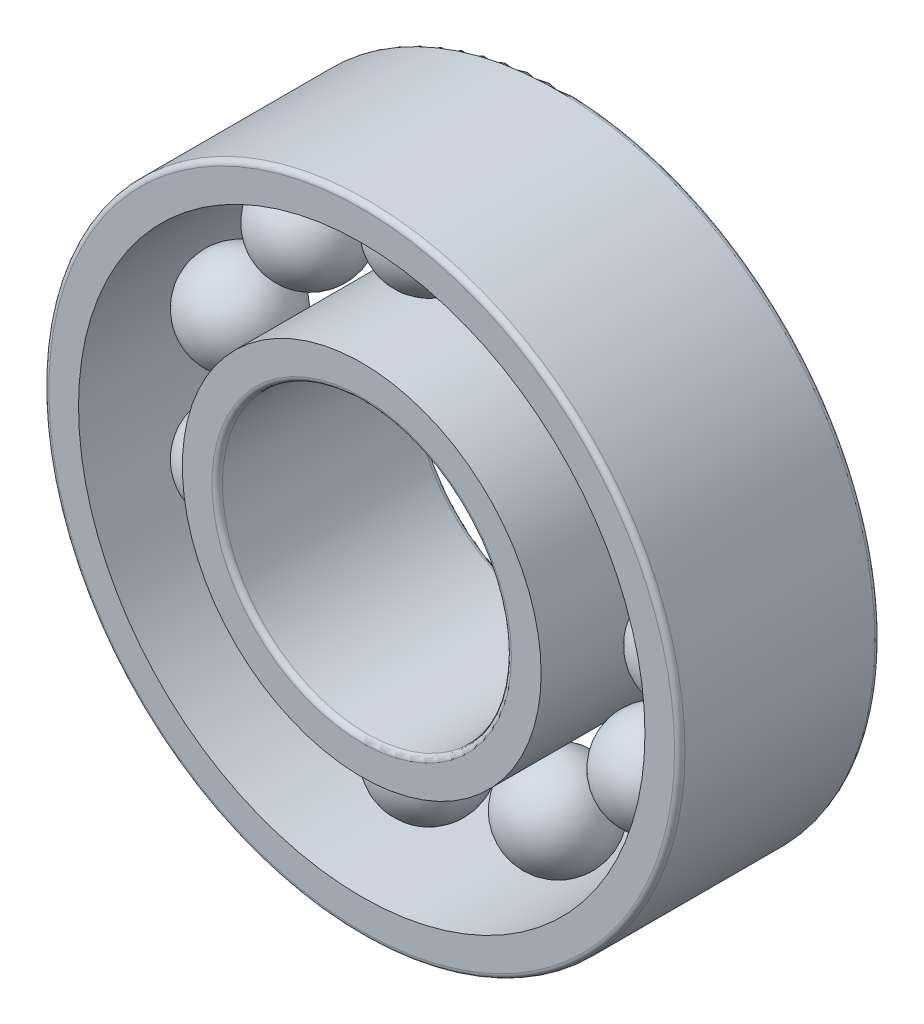
ISO-10303-21;
HEADER;
FILE_DESCRIPTION(('STEP AP214'),'2;1');
FILE_NAME('part.step','',(''),(''),'','','');
FILE_SCHEMA(('AUTOMOTIVE_DESIGN { 1 0 10303 214 1 1 1 1 }'));
ENDSEC;
DATA;
#1=APPLICATION_CONTEXT('core data for automotive mechanical design processes');
#2=APPLICATION_PROTOCOL_DEFINITION('international standard','automotive_design',2000,#1);
#3=PRODUCT_CONTEXT('',#1,'mechanical');
#4=PRODUCT('Part','Part','',(#3));
#5=PRODUCT_RELATED_PRODUCT_CATEGORY('part','',(#4));
#6=PRODUCT_DEFINITION_FORMATION('','',#4);
#7=PRODUCT_DEFINITION_CONTEXT('part definition',#1,'design');
#8=PRODUCT_DEFINITION('design','',#6,#7);
#9=PRODUCT_DEFINITION_SHAPE('','',#8);
#10=(LENGTH_UNIT() NAMED_UNIT(*) SI_UNIT(.MILLI.,.METRE.));
#11=(NAMED_UNIT(*) PLANE_ANGLE_UNIT() SI_UNIT($,.RADIAN.));
#12=(NAMED_UNIT(*) SI_UNIT($,.STERADIAN.) SOLID_ANGLE_UNIT());
#13=UNCERTAINTY_MEASURE_WITH_UNIT(LENGTH_MEASURE(1.E-05),#10,'distance_accuracy_value','');
#14=(GEOMETRIC_REPRESENTATION_CONTEXT(3) GLOBAL_UNCERTAINTY_ASSIGNED_CONTEXT((#13)) GLOBAL_UNIT_ASSIGNED_CONTEXT((#10,
#11,#12)) REPRESENTATION_CONTEXT('',''));
#15=CARTESIAN_POINT('',(0.,0.,0.));
#16=DIRECTION('',(0.,0.,1.));
#17=DIRECTION('',(1.,0.,0.));
#18=AXIS2_PLACEMENT_3D('',#15,#16,#17);
#19=CARTESIAN_POINT('',(10.683919866956,-6.86613838168609,0.));
#20=DIRECTION('',(-0.841253532831181,0.540640817455598,0.));
#21=DIRECTION('',(0.,0.,-1.));
#22=AXIS2_PLACEMENT_3D('',#19,#20,#21);
#23=SPHERICAL_SURFACE('',#22,2.7075);
#24=CARTESIAN_POINT('',(8.40622592681558,-5.40235336842506,0.));
#25=VERTEX_POINT('',#24);
#26=VERTEX_LOOP('',#25);
#27=FACE_BOUND('',#26,.T.);
#28=ADVANCED_FACE('F38',(#27),#23,.T.);
#29=CLOSED_SHELL('',(#28));
#30=MANIFOLD_SOLID_BREP('B2',#29);
#31=CARTESIAN_POINT('',(5.27577066512395,-11.5523263410024,0.));
#32=DIRECTION('',(-0.415415013001886,0.909631995354519,0.));
#33=DIRECTION('',(0.,0.,-1.));
#34=AXIS2_PLACEMENT_3D('',#31,#32,#33);
#35=SPHERICAL_SURFACE('',#34,2.7075);
#36=CARTESIAN_POINT('',(4.15103451742135,-9.08949771358003,0.));
#37=VERTEX_POINT('',#36);
#38=VERTEX_LOOP('',#37);
#39=FACE_BOUND('',#38,.T.);
#40=ADVANCED_FACE('F57',(#39),#35,.T.);
#41=CLOSED_SHELL('',(#40));
#42=MANIFOLD_SOLID_BREP('B6',#41);
#43=CARTESIAN_POINT('',(-1.80739844607072,-12.5707323118878,0.));
#44=DIRECTION('',(0.142314838273285,0.989821441880933,0.));
#45=DIRECTION('',(0.,0.,-1.));
#46=AXIS2_PLACEMENT_3D('',#43,#44,#45);
#47=SPHERICAL_SURFACE('',#46,2.7075);
#48=CARTESIAN_POINT('',(-1.4220810214458,-9.89079075799522,0.));
#49=VERTEX_POINT('',#48);
#50=VERTEX_LOOP('',#49);
#51=FACE_BOUND('',#50,.T.);
#52=ADVANCED_FACE('F76',(#51),#47,.T.);
#53=CLOSED_SHELL('',(#52));
#54=MANIFOLD_SOLID_BREP('B34',#53);
#55=CARTESIAN_POINT('',(-8.31673132110512,-9.59801959429908,0.));
#56=DIRECTION('',(0.654860733945285,0.755749574354258,0.));
#57=DIRECTION('',(0.,0.,-1.));
#58=AXIS2_PLACEMENT_3D('',#55,#56,#57);
#59=SPHERICAL_SURFACE('',#58,2.7075);
#60=CARTESIAN_POINT('',(-6.54369588394826,-7.55182762173492,0.));
#61=VERTEX_POINT('',#60);
#62=VERTEX_LOOP('',#61);
#63=FACE_BOUND('',#62,.T.);
#64=ADVANCED_FACE('F95',(#63),#59,.T.);
#65=CLOSED_SHELL('',(#64));
#66=MANIFOLD_SOLID_BREP('B53',#65);
#67=CARTESIAN_POINT('',(-12.1855607649041,-3.57800347188615,0.));
#68=DIRECTION('',(0.959492973614497,0.281732556841429,0.));
#69=DIRECTION('',(0.,0.,-1.));
#70=AXIS2_PLACEMENT_3D('',#67,#68,#69);
#71=SPHERICAL_SURFACE('',#70,2.7075);
#72=CARTESIAN_POINT('',(-9.58773353884287,-2.81521257423798,0.));
#73=VERTEX_POINT('',#72);
#74=VERTEX_LOOP('',#73);
#75=FACE_BOUND('',#74,.T.);
#76=ADVANCED_FACE('F114',(#75),#71,.T.);
#77=CLOSED_SHELL('',(#76));
#78=MANIFOLD_SOLID_BREP('B72',#77);
#79=CARTESIAN_POINT('',(-12.1855607649041,3.57800347188616,0.));
#80=DIRECTION('',(0.959492973614498,-0.28173255684143,0.));
#81=DIRECTION('',(0.,0.,-1.));
#82=AXIS2_PLACEMENT_3D('',#79,#80,#81);
#83=SPHERICAL_SURFACE('',#82,2.7075);
#84=CARTESIAN_POINT('',(-9.58773353884287,2.81521257423799,0.));
#85=VERTEX_POINT('',#84);
#86=VERTEX_LOOP('',#85);
#87=FACE_BOUND('',#86,.T.);
#88=ADVANCED_FACE('F133',(#87),#83,.T.);
#89=CLOSED_SHELL('',(#88));
#90=MANIFOLD_SOLID_BREP('B91',#89);
#91=CARTESIAN_POINT('',(-8.31673132110512,9.59801959429908,0.));
#92=DIRECTION('',(0.654860733945285,-0.755749574354258,0.));
#93=DIRECTION('',(0.,0.,-1.));
#94=AXIS2_PLACEMENT_3D('',#91,#92,#93);
#95=SPHERICAL_SURFACE('',#94,2.7075);
#96=CARTESIAN_POINT('',(-6.54369588394826,7.55182762173493,0.));
#97=VERTEX_POINT('',#96);
#98=VERTEX_LOOP('',#97);
#99=FACE_BOUND('',#98,.T.);
#100=ADVANCED_FACE('F152',(#99),#95,.T.);
#101=CLOSED_SHELL('',(#100));
#102=MANIFOLD_SOLID_BREP('B110',#101);
#103=CARTESIAN_POINT('',(-1.80739844607072,12.5707323118878,0.));
#104=DIRECTION('',(0.142314838273285,-0.989821441880933,0.));
#105=DIRECTION('',(0.,0.,-1.));
#106=AXIS2_PLACEMENT_3D('',#103,#104,#105);
#107=SPHERICAL_SURFACE('',#106,2.7075);
#108=CARTESIAN_POINT('',(-1.4220810214458,9.89079075799522,0.));
#109=VERTEX_POINT('',#108);
#110=VERTEX_LOOP('',#109);
#111=FACE_BOUND('',#110,.T.);
#112=ADVANCED_FACE('F171',(#111),#107,.T.);
#113=CLOSED_SHELL('',(#112));
#114=MANIFOLD_SOLID_BREP('B129',#113);
#115=CARTESIAN_POINT('',(5.27577066512396,11.5523263410024,0.));
#116=DIRECTION('',(-0.415415013001886,-0.909631995354518,0.));
#117=DIRECTION('',(0.,0.,-1.));
#118=AXIS2_PLACEMENT_3D('',#115,#116,#117);
#119=SPHERICAL_SURFACE('',#118,2.7075);
#120=CARTESIAN_POINT('',(4.15103451742135,9.08949771358002,0.));
#121=VERTEX_POINT('',#120);
#122=VERTEX_LOOP('',#121);
#123=FACE_BOUND('',#122,.T.);
#124=ADVANCED_FACE('F190',(#123),#119,.T.);
#125=CLOSED_SHELL('',(#124));
#126=MANIFOLD_SOLID_BREP('B148',#125);
#127=CARTESIAN_POINT('',(10.683919866956,6.86613838168609,0.));
#128=DIRECTION('',(-0.841253532831181,-0.540640817455598,0.));
#129=DIRECTION('',(0.,0.,-1.));
#130=AXIS2_PLACEMENT_3D('',#127,#128,#129);
#131=SPHERICAL_SURFACE('',#130,2.7075);
#132=CARTESIAN_POINT('',(8.40622592681558,5.40235336842506,0.));
#133=VERTEX_POINT('',#132);
#134=VERTEX_LOOP('',#133);
#135=FACE_BOUND('',#134,.T.);
#136=ADVANCED_FACE('F209',(#135),#131,.T.);
#137=CLOSED_SHELL('',(#136));
#138=MANIFOLD_SOLID_BREP('B167',#137);
#139=CARTESIAN_POINT('',(12.7,0.,0.));
#140=DIRECTION('',(-1.,0.,0.));
#141=DIRECTION('',(0.,0.,-1.));
#142=AXIS2_PLACEMENT_3D('',#139,#140,#141);
#143=SPHERICAL_SURFACE('',#142,2.7075);
#144=CARTESIAN_POINT('',(9.9925,0.,0.));
#145=VERTEX_POINT('',#144);
#146=VERTEX_LOOP('',#145);
#147=FACE_BOUND('',#146,.T.);
#148=ADVANCED_FACE('F230',(#147),#143,.T.);
#149=CLOSED_SHELL('',(#148));
#150=MANIFOLD_SOLID_BREP('B186',#149);
#151=CARTESIAN_POINT('',(0.,0.,9.25));
#152=DIRECTION('',(0.,0.,1.));
#153=DIRECTION('',(1.,0.,0.));
#154=AXIS2_PLACEMENT_3D('',#151,#152,#153);
#155=CYLINDRICAL_SURFACE('',#154,15.55);
#156=CARTESIAN_POINT('',(0.,0.,5.5));
#157=DIRECTION('',(0.,0.,1.));
#158=DIRECTION('',(1.,0.,0.));
#159=AXIS2_PLACEMENT_3D('',#156,#157,#158);
#160=CIRCLE('',#159,15.55);
#161=CARTESIAN_POINT('',(15.55,0.,5.5));
#162=VERTEX_POINT('',#161);
#163=EDGE_CURVE('E270',#162,#162,#160,.T.);
#164=ORIENTED_EDGE('',*,*,#163,.T.);
#165=EDGE_LOOP('',(#164));
#166=FACE_BOUND('',#165,.T.);
#167=CARTESIAN_POINT('',(0.,0.,-5.5));
#168=DIRECTION('',(0.,0.,1.));
#169=DIRECTION('',(1.,0.,0.));
#170=AXIS2_PLACEMENT_3D('',#167,#168,#169);
#171=CIRCLE('',#170,15.55);
#172=CARTESIAN_POINT('',(15.55,0.,-5.5));
#173=VERTEX_POINT('',#172);
#174=EDGE_CURVE('E273',#173,#173,#171,.T.);
#175=ORIENTED_EDGE('',*,*,#174,.F.);
#176=EDGE_LOOP('',(#175));
#177=FACE_BOUND('',#176,.T.);
#178=ADVANCED_FACE('F250',(#166,#177),#155,.F.);
#179=CARTESIAN_POINT('',(15.55,0.,5.5));
#180=DIRECTION('',(0.,0.,1.));
#181=DIRECTION('',(1.,0.,0.));
#182=AXIS2_PLACEMENT_3D('',#179,#180,#181);
#183=PLANE('',#182);
#184=CARTESIAN_POINT('',(0.,0.,5.5));
#185=DIRECTION('',(0.,0.,1.));
#186=DIRECTION('',(1.,0.,0.));
#187=AXIS2_PLACEMENT_3D('',#184,#185,#186);
#188=CIRCLE('',#187,17.17675);
#189=CARTESIAN_POINT('',(17.17675,0.,5.5));
#190=VERTEX_POINT('',#189);
#191=EDGE_CURVE('E229',#190,#190,#188,.T.);
#192=ORIENTED_EDGE('',*,*,#191,.T.);
#193=EDGE_LOOP('',(#192));
#194=FACE_BOUND('',#193,.T.);
#195=ORIENTED_EDGE('',*,*,#163,.F.);
#196=EDGE_LOOP('',(#195));
#197=FACE_BOUND('',#196,.T.);
#198=ADVANCED_FACE('F280',(#194,#197),#183,.T.);
#199=CARTESIAN_POINT('',(0.,0.,9.25));
#200=DIRECTION('',(0.,0.,1.));
#201=DIRECTION('',(1.,0.,0.));
#202=AXIS2_PLACEMENT_3D('',#199,#200,#201);
#203=CYLINDRICAL_SURFACE('',#202,17.4625);
#204=CARTESIAN_POINT('',(0.,0.,-5.21425));
#205=DIRECTION('',(0.,0.,-1.));
#206=DIRECTION('',(-1.,0.,0.));
#207=AXIS2_PLACEMENT_3D('',#204,#205,#206);
#208=CIRCLE('',#207,17.4625);
#209=CARTESIAN_POINT('',(-17.4625,0.,-5.21425));
#210=VERTEX_POINT('',#209);
#211=EDGE_CURVE('E261',#210,#210,#208,.F.);
#212=ORIENTED_EDGE('',*,*,#211,.T.);
#213=EDGE_LOOP('',(#212));
#214=FACE_BOUND('',#213,.T.);
#215=CARTESIAN_POINT('',(0.,0.,5.21425));
#216=DIRECTION('',(0.,0.,1.));
#217=DIRECTION('',(1.,0.,0.));
#218=AXIS2_PLACEMENT_3D('',#215,#216,#217);
#219=CIRCLE('',#218,17.4625);
#220=CARTESIAN_POINT('',(17.4625,0.,5.21425));
#221=VERTEX_POINT('',#220);
#222=EDGE_CURVE('E265',#221,#221,#219,.F.);
#223=ORIENTED_EDGE('',*,*,#222,.T.);
#224=EDGE_LOOP('',(#223));
#225=FACE_BOUND('',#224,.T.);
#226=ADVANCED_FACE('F286',(#214,#225),#203,.T.);
#227=CARTESIAN_POINT('',(17.4625,0.,-5.5));
#228=DIRECTION('',(0.,0.,-1.));
#229=DIRECTION('',(-1.,0.,0.));
#230=AXIS2_PLACEMENT_3D('',#227,#228,#229);
#231=PLANE('',#230);
#232=CARTESIAN_POINT('',(0.,0.,-5.5));
#233=DIRECTION('',(0.,0.,-1.));
#234=DIRECTION('',(-1.,0.,0.));
#235=AXIS2_PLACEMENT_3D('',#232,#233,#234);
#236=CIRCLE('',#235,17.17675);
#237=CARTESIAN_POINT('',(-17.17675,0.,-5.5));
#238=VERTEX_POINT('',#237);
#239=EDGE_CURVE('E257',#238,#238,#236,.T.);
#240=ORIENTED_EDGE('',*,*,#239,.T.);
#241=EDGE_LOOP('',(#240));
#242=FACE_BOUND('',#241,.T.);
#243=ORIENTED_EDGE('',*,*,#174,.T.);
#244=EDGE_LOOP('',(#243));
#245=FACE_BOUND('',#244,.T.);
#246=ADVANCED_FACE('F277',(#242,#245),#231,.T.);
#247=CARTESIAN_POINT('',(0.,0.,-5.21425));
#248=DIRECTION('',(0.,0.,-1.));
#249=DIRECTION('',(-1.,0.,0.));
#250=AXIS2_PLACEMENT_3D('',#247,#248,#249);
#251=TOROIDAL_SURFACE('',#250,17.17675,0.28575);
#252=ORIENTED_EDGE('',*,*,#239,.F.);
#253=EDGE_LOOP('',(#252));
#254=FACE_BOUND('',#253,.T.);
#255=ORIENTED_EDGE('',*,*,#211,.F.);
#256=EDGE_LOOP('',(#255));
#257=FACE_BOUND('',#256,.T.);
#258=ADVANCED_FACE('F289',(#254,#257),#251,.T.);
#259=CARTESIAN_POINT('',(0.,0.,5.21425));
#260=DIRECTION('',(0.,0.,1.));
#261=DIRECTION('',(1.,0.,0.));
#262=AXIS2_PLACEMENT_3D('',#259,#260,#261);
#263=TOROIDAL_SURFACE('',#262,17.17675,0.28575);
#264=ORIENTED_EDGE('',*,*,#222,.F.);
#265=EDGE_LOOP('',(#264));
#266=FACE_BOUND('',#265,.T.);
#267=ORIENTED_EDGE('',*,*,#191,.F.);
#268=EDGE_LOOP('',(#267));
#269=FACE_BOUND('',#268,.T.);
#270=ADVANCED_FACE('F252',(#266,#269),#263,.T.);
#271=CLOSED_SHELL('',(#178,#198,#226,#246,#258,#270));
#272=MANIFOLD_SOLID_BREP('B205',#271);
#273=CARTESIAN_POINT('',(0.,0.,9.25));
#274=DIRECTION('',(0.,0.,1.));
#275=DIRECTION('',(1.,0.,0.));
#276=AXIS2_PLACEMENT_3D('',#273,#274,#275);
#277=CYLINDRICAL_SURFACE('',#276,7.9375);
#278=CARTESIAN_POINT('',(0.,0.,-5.21425));
#279=DIRECTION('',(0.,0.,-1.));
#280=DIRECTION('',(-1.,0.,0.));
#281=AXIS2_PLACEMENT_3D('',#278,#279,#280);
#282=CIRCLE('',#281,7.9375);
#283=CARTESIAN_POINT('',(-7.9375,0.,-5.21425));
#284=VERTEX_POINT('',#283);
#285=EDGE_CURVE('E349',#284,#284,#282,.T.);
#286=ORIENTED_EDGE('',*,*,#285,.T.);
#287=EDGE_LOOP('',(#286));
#288=FACE_BOUND('',#287,.T.);
#289=CARTESIAN_POINT('',(0.,0.,5.21425));
#290=DIRECTION('',(0.,0.,1.));
#291=DIRECTION('',(1.,0.,0.));
#292=AXIS2_PLACEMENT_3D('',#289,#290,#291);
#293=CIRCLE('',#292,7.9375);
#294=CARTESIAN_POINT('',(7.9375,0.,5.21425));
#295=VERTEX_POINT('',#294);
#296=EDGE_CURVE('E353',#295,#295,#293,.T.);
#297=ORIENTED_EDGE('',*,*,#296,.T.);
#298=EDGE_LOOP('',(#297));
#299=FACE_BOUND('',#298,.T.);
#300=ADVANCED_FACE('F342',(#288,#299),#277,.F.);
#301=CARTESIAN_POINT('',(7.9375,0.,5.5));
#302=DIRECTION('',(0.,0.,1.));
#303=DIRECTION('',(1.,0.,0.));
#304=AXIS2_PLACEMENT_3D('',#301,#302,#303);
#305=PLANE('',#304);
#306=CARTESIAN_POINT('',(0.,0.,5.5));
#307=DIRECTION('',(0.,0.,1.));
#308=DIRECTION('',(1.,0.,0.));
#309=AXIS2_PLACEMENT_3D('',#306,#307,#308);
#310=CIRCLE('',#309,8.22325);
#311=CARTESIAN_POINT('',(8.22325,0.,5.5));
#312=VERTEX_POINT('',#311);
#313=EDGE_CURVE('E249',#312,#312,#310,.F.);
#314=ORIENTED_EDGE('',*,*,#313,.T.);
#315=EDGE_LOOP('',(#314));
#316=FACE_BOUND('',#315,.T.);
#317=CARTESIAN_POINT('',(0.,0.,5.5));
#318=DIRECTION('',(0.,0.,1.));
#319=DIRECTION('',(1.,0.,0.));
#320=AXIS2_PLACEMENT_3D('',#317,#318,#319);
#321=CIRCLE('',#320,9.85);
#322=CARTESIAN_POINT('',(9.85,0.,5.5));
#323=VERTEX_POINT('',#322);
#324=EDGE_CURVE('E362',#323,#323,#321,.T.);
#325=ORIENTED_EDGE('',*,*,#324,.T.);
#326=EDGE_LOOP('',(#325));
#327=FACE_BOUND('',#326,.T.);
#328=ADVANCED_FACE('F382',(#316,#327),#305,.T.);
#329=CARTESIAN_POINT('',(0.,0.,9.25));
#330=DIRECTION('',(0.,0.,1.));
#331=DIRECTION('',(1.,0.,0.));
#332=AXIS2_PLACEMENT_3D('',#329,#330,#331);
#333=CYLINDRICAL_SURFACE('',#332,9.85);
#334=CARTESIAN_POINT('',(0.,0.,-5.5));
#335=DIRECTION('',(0.,0.,1.));
#336=DIRECTION('',(1.,0.,0.));
#337=AXIS2_PLACEMENT_3D('',#334,#335,#336);
#338=CIRCLE('',#337,9.85);
#339=CARTESIAN_POINT('',(9.85,0.,-5.5));
#340=VERTEX_POINT('',#339);
#341=EDGE_CURVE('E365',#340,#340,#338,.T.);
#342=ORIENTED_EDGE('',*,*,#341,.T.);
#343=EDGE_LOOP('',(#342));
#344=FACE_BOUND('',#343,.T.);
#345=ORIENTED_EDGE('',*,*,#324,.F.);
#346=EDGE_LOOP('',(#345));
#347=FACE_BOUND('',#346,.T.);
#348=ADVANCED_FACE('F369',(#344,#347),#333,.T.);
#349=CARTESIAN_POINT('',(9.85,0.,-5.5));
#350=DIRECTION('',(0.,0.,-1.));
#351=DIRECTION('',(-1.,0.,0.));
#352=AXIS2_PLACEMENT_3D('',#349,#350,#351);
#353=PLANE('',#352);
#354=CARTESIAN_POINT('',(0.,0.,-5.5));
#355=DIRECTION('',(0.,0.,-1.));
#356=DIRECTION('',(-1.,0.,0.));
#357=AXIS2_PLACEMENT_3D('',#354,#355,#356);
#358=CIRCLE('',#357,8.22325);
#359=CARTESIAN_POINT('',(-8.22325,0.,-5.5));
#360=VERTEX_POINT('',#359);
#361=EDGE_CURVE('E357',#360,#360,#358,.F.);
#362=ORIENTED_EDGE('',*,*,#361,.T.);
#363=EDGE_LOOP('',(#362));
#364=FACE_BOUND('',#363,.T.);
#365=ORIENTED_EDGE('',*,*,#341,.F.);
#366=EDGE_LOOP('',(#365));
#367=FACE_BOUND('',#366,.T.);
#368=ADVANCED_FACE('F372',(#364,#367),#353,.T.);
#369=CARTESIAN_POINT('',(0.,0.,-5.21425));
#370=DIRECTION('',(0.,0.,-1.));
#371=DIRECTION('',(-1.,0.,0.));
#372=AXIS2_PLACEMENT_3D('',#369,#370,#371);
#373=TOROIDAL_SURFACE('',#372,8.22325,0.28575);
#374=ORIENTED_EDGE('',*,*,#285,.F.);
#375=EDGE_LOOP('',(#374));
#376=FACE_BOUND('',#375,.T.);
#377=ORIENTED_EDGE('',*,*,#361,.F.);
#378=EDGE_LOOP('',(#377));
#379=FACE_BOUND('',#378,.T.);
#380=ADVANCED_FACE('F374',(#376,#379),#373,.T.);
#381=CARTESIAN_POINT('',(0.,0.,5.21425));
#382=DIRECTION('',(0.,0.,1.));
#383=DIRECTION('',(1.,0.,0.));
#384=AXIS2_PLACEMENT_3D('',#381,#382,#383);
#385=TOROIDAL_SURFACE('',#384,8.22325,0.28575);
#386=ORIENTED_EDGE('',*,*,#313,.F.);
#387=EDGE_LOOP('',(#386));
#388=FACE_BOUND('',#387,.T.);
#389=ORIENTED_EDGE('',*,*,#296,.F.);
#390=EDGE_LOOP('',(#389));
#391=FACE_BOUND('',#390,.T.);
#392=ADVANCED_FACE('F344',(#388,#391),#385,.T.);
#393=CLOSED_SHELL('',(#300,#328,#348,#368,#380,#392));
#394=MANIFOLD_SOLID_BREP('B224',#393);
#395=ADVANCED_BREP_SHAPE_REPRESENTATION('',(#18,#30,#42,#54,#66,#78,#90,#102,#114,#126,#138,
#150,#272,#394),#14);
#396=SHAPE_DEFINITION_REPRESENTATION(#9,#395);
ENDSEC;
END-ISO-10303-21;
